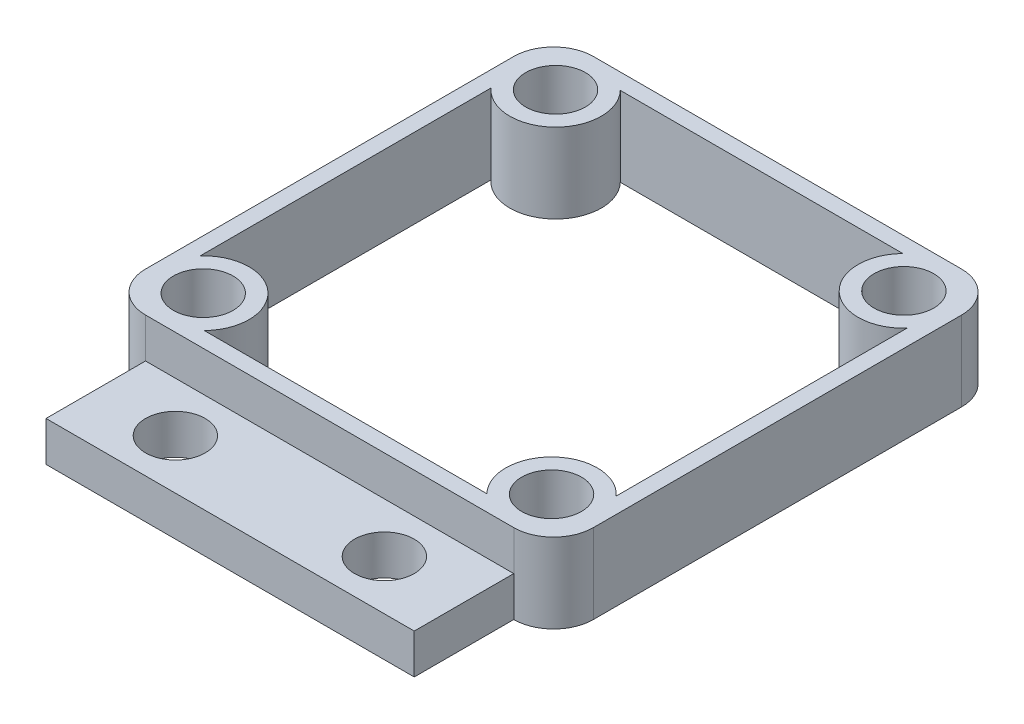
ISO-10303-21;
HEADER;
FILE_DESCRIPTION(('STEP AP214'),'2;1');
FILE_NAME('part.step','',(''),(''),'','','');
FILE_SCHEMA(('AUTOMOTIVE_DESIGN { 1 0 10303 214 1 1 1 1 }'));
ENDSEC;
DATA;
#1=APPLICATION_CONTEXT('core data for automotive mechanical design processes');
#2=APPLICATION_PROTOCOL_DEFINITION('international standard','automotive_design',2000,#1);
#3=PRODUCT_CONTEXT('',#1,'mechanical');
#4=PRODUCT('Part','Part','',(#3));
#5=PRODUCT_RELATED_PRODUCT_CATEGORY('part','',(#4));
#6=PRODUCT_DEFINITION_FORMATION('','',#4);
#7=PRODUCT_DEFINITION_CONTEXT('part definition',#1,'design');
#8=PRODUCT_DEFINITION('design','',#6,#7);
#9=PRODUCT_DEFINITION_SHAPE('','',#8);
#10=(LENGTH_UNIT() NAMED_UNIT(*) SI_UNIT(.MILLI.,.METRE.));
#11=(NAMED_UNIT(*) PLANE_ANGLE_UNIT() SI_UNIT($,.RADIAN.));
#12=(NAMED_UNIT(*) SI_UNIT($,.STERADIAN.) SOLID_ANGLE_UNIT());
#13=UNCERTAINTY_MEASURE_WITH_UNIT(LENGTH_MEASURE(1.E-05),#10,'distance_accuracy_value','');
#14=(GEOMETRIC_REPRESENTATION_CONTEXT(3) GLOBAL_UNCERTAINTY_ASSIGNED_CONTEXT((#13)) GLOBAL_UNIT_ASSIGNED_CONTEXT((#10,
#11,#12)) REPRESENTATION_CONTEXT('',''));
#15=CARTESIAN_POINT('',(0.,0.,0.));
#16=DIRECTION('',(0.,0.,1.));
#17=DIRECTION('',(1.,0.,0.));
#18=AXIS2_PLACEMENT_3D('',#15,#16,#17);
#19=CARTESIAN_POINT('',(-9.24999999999998,4.,11.25));
#20=DIRECTION('',(0.,0.,-1.));
#21=DIRECTION('',(-1.,0.,0.));
#22=AXIS2_PLACEMENT_3D('',#19,#20,#21);
#23=PLANE('',#22);
#24=DIRECTION('',(-1.,0.,0.));
#25=VECTOR('',#24,1.);
#26=CARTESIAN_POINT('',(0.,2.,11.25));
#27=LINE('',#26,#25);
#28=CARTESIAN_POINT('',(9.24999999999999,2.,11.25));
#29=VERTEX_POINT('',#28);
#30=CARTESIAN_POINT('',(-9.25,2.,11.25));
#31=VERTEX_POINT('',#30);
#32=EDGE_CURVE('E375',#29,#31,#27,.T.);
#33=ORIENTED_EDGE('',*,*,#32,.F.);
#34=DIRECTION('',(0.,-1.,0.));
#35=VECTOR('',#34,1.);
#36=CARTESIAN_POINT('',(9.24999999999999,4.,11.25));
#37=LINE('',#36,#35);
#38=CARTESIAN_POINT('',(9.24999999999999,4.,11.25));
#39=VERTEX_POINT('',#38);
#40=EDGE_CURVE('E321',#39,#29,#37,.T.);
#41=ORIENTED_EDGE('',*,*,#40,.F.);
#42=DIRECTION('',(1.,0.,0.));
#43=VECTOR('',#42,1.);
#44=CARTESIAN_POINT('',(-9.24999999999998,4.,11.25));
#45=LINE('',#44,#43);
#46=CARTESIAN_POINT('',(-9.25,4.,11.25));
#47=VERTEX_POINT('',#46);
#48=EDGE_CURVE('E295',#47,#39,#45,.T.);
#49=ORIENTED_EDGE('',*,*,#48,.F.);
#50=DIRECTION('',(0.,-1.,0.));
#51=VECTOR('',#50,1.);
#52=CARTESIAN_POINT('',(-9.25,4.,11.25));
#53=LINE('',#52,#51);
#54=EDGE_CURVE('E324',#47,#31,#53,.T.);
#55=ORIENTED_EDGE('',*,*,#54,.T.);
#56=EDGE_LOOP('',(#33,#41,#49,#55));
#57=FACE_BOUND('',#56,.T.);
#58=ADVANCED_FACE('F43',(#57),#23,.F.);
#59=CARTESIAN_POINT('',(9.25,4.,-9.25));
#60=DIRECTION('',(0.,-1.,0.));
#61=DIRECTION('',(0.,0.,-1.));
#62=AXIS2_PLACEMENT_3D('',#59,#60,#61);
#63=PLANE('',#62);
#64=CARTESIAN_POINT('',(-8.74999999999999,4.,8.85000000000002));
#65=DIRECTION('',(0.,1.,0.));
#66=DIRECTION('',(0.,0.,1.));
#67=AXIS2_PLACEMENT_3D('',#64,#65,#66);
#68=CIRCLE('',#67,1.5);
#69=CARTESIAN_POINT('',(-8.74999999999999,4.,10.35));
#70=VERTEX_POINT('',#69);
#71=EDGE_CURVE('E259',#70,#70,#68,.T.);
#72=ORIENTED_EDGE('',*,*,#71,.F.);
#73=EDGE_LOOP('',(#72));
#74=FACE_BOUND('',#73,.T.);
#75=CARTESIAN_POINT('',(-8.74999999999999,4.,-8.84999999999998));
#76=DIRECTION('',(0.,1.,0.));
#77=DIRECTION('',(0.,0.,-1.));
#78=AXIS2_PLACEMENT_3D('',#75,#76,#77);
#79=CIRCLE('',#78,1.5);
#80=CARTESIAN_POINT('',(-8.74999999999999,4.,-10.35));
#81=VERTEX_POINT('',#80);
#82=EDGE_CURVE('E265',#81,#81,#79,.T.);
#83=ORIENTED_EDGE('',*,*,#82,.F.);
#84=EDGE_LOOP('',(#83));
#85=FACE_BOUND('',#84,.T.);
#86=CARTESIAN_POINT('',(8.75000000000004,4.,8.85000000000001));
#87=DIRECTION('',(0.,1.,0.));
#88=DIRECTION('',(0.,0.,-1.));
#89=AXIS2_PLACEMENT_3D('',#86,#87,#88);
#90=CIRCLE('',#89,1.5);
#91=CARTESIAN_POINT('',(8.75000000000004,4.,7.35000000000001));
#92=VERTEX_POINT('',#91);
#93=EDGE_CURVE('E271',#92,#92,#90,.T.);
#94=ORIENTED_EDGE('',*,*,#93,.F.);
#95=EDGE_LOOP('',(#94));
#96=FACE_BOUND('',#95,.T.);
#97=CARTESIAN_POINT('',(8.75,4.,-8.85));
#98=DIRECTION('',(0.,1.,0.));
#99=DIRECTION('',(0.,0.,1.));
#100=AXIS2_PLACEMENT_3D('',#97,#98,#99);
#101=CIRCLE('',#100,1.5);
#102=CARTESIAN_POINT('',(8.75,4.,-7.35));
#103=VERTEX_POINT('',#102);
#104=EDGE_CURVE('E277',#103,#103,#101,.T.);
#105=ORIENTED_EDGE('',*,*,#104,.F.);
#106=EDGE_LOOP('',(#105));
#107=FACE_BOUND('',#106,.T.);
#108=CARTESIAN_POINT('',(9.25,4.,-9.25));
#109=DIRECTION('',(0.,1.,0.));
#110=DIRECTION('',(0.,0.,-1.));
#111=AXIS2_PLACEMENT_3D('',#108,#109,#110);
#112=CIRCLE('',#111,2.);
#113=CARTESIAN_POINT('',(11.25,4.,-9.24999999999998));
#114=VERTEX_POINT('',#113);
#115=CARTESIAN_POINT('',(9.24999999999998,4.,-11.25));
#116=VERTEX_POINT('',#115);
#117=EDGE_CURVE('E283',#114,#116,#112,.T.);
#118=ORIENTED_EDGE('',*,*,#117,.T.);
#119=DIRECTION('',(-1.,0.,0.));
#120=VECTOR('',#119,1.);
#121=CARTESIAN_POINT('',(-9.24999999999999,4.,-11.25));
#122=LINE('',#121,#120);
#123=CARTESIAN_POINT('',(-9.24999999999999,4.,-11.25));
#124=VERTEX_POINT('',#123);
#125=EDGE_CURVE('E286',#116,#124,#122,.T.);
#126=ORIENTED_EDGE('',*,*,#125,.T.);
#127=CARTESIAN_POINT('',(-9.25,4.,-9.25));
#128=DIRECTION('',(0.,1.,0.));
#129=DIRECTION('',(0.,0.,1.));
#130=AXIS2_PLACEMENT_3D('',#127,#128,#129);
#131=CIRCLE('',#130,2.);
#132=CARTESIAN_POINT('',(-11.25,4.,-9.24999999999998));
#133=VERTEX_POINT('',#132);
#134=EDGE_CURVE('E289',#124,#133,#131,.T.);
#135=ORIENTED_EDGE('',*,*,#134,.T.);
#136=DIRECTION('',(0.,0.,1.));
#137=VECTOR('',#136,1.);
#138=CARTESIAN_POINT('',(-11.25,4.,-9.24999999999998));
#139=LINE('',#138,#137);
#140=CARTESIAN_POINT('',(-11.25,4.,9.24999999999999));
#141=VERTEX_POINT('',#140);
#142=EDGE_CURVE('E291',#133,#141,#139,.T.);
#143=ORIENTED_EDGE('',*,*,#142,.T.);
#144=CARTESIAN_POINT('',(-9.25,4.,9.25));
#145=DIRECTION('',(0.,1.,0.));
#146=DIRECTION('',(0.,0.,1.));
#147=AXIS2_PLACEMENT_3D('',#144,#145,#146);
#148=CIRCLE('',#147,2.);
#149=EDGE_CURVE('E293',#141,#47,#148,.T.);
#150=ORIENTED_EDGE('',*,*,#149,.T.);
#151=ORIENTED_EDGE('',*,*,#48,.T.);
#152=CARTESIAN_POINT('',(9.25,4.,9.25));
#153=DIRECTION('',(0.,1.,0.));
#154=DIRECTION('',(0.,0.,1.));
#155=AXIS2_PLACEMENT_3D('',#152,#153,#154);
#156=CIRCLE('',#155,2.);
#157=CARTESIAN_POINT('',(11.25,4.,9.24999999999999));
#158=VERTEX_POINT('',#157);
#159=EDGE_CURVE('E297',#39,#158,#156,.T.);
#160=ORIENTED_EDGE('',*,*,#159,.T.);
#161=DIRECTION('',(0.,0.,-1.));
#162=VECTOR('',#161,1.);
#163=CARTESIAN_POINT('',(11.25,4.,-9.24999999999998));
#164=LINE('',#163,#162);
#165=EDGE_CURVE('E299',#158,#114,#164,.T.);
#166=ORIENTED_EDGE('',*,*,#165,.T.);
#167=EDGE_LOOP('',(#118,#126,#135,#143,#150,#151,#160,#166));
#168=FACE_BOUND('',#167,.T.);
#169=CARTESIAN_POINT('',(8.75,4.,-8.85));
#170=DIRECTION('',(0.,-1.,0.));
#171=DIRECTION('',(0.,0.,1.));
#172=AXIS2_PLACEMENT_3D('',#169,#170,#171);
#173=CIRCLE('',#172,2.3);
#174=CARTESIAN_POINT('',(10.45,4.,-7.30080666151704));
#175=VERTEX_POINT('',#174);
#176=CARTESIAN_POINT('',(7.09772883581416,4.,-10.45));
#177=VERTEX_POINT('',#176);
#178=EDGE_CURVE('E207',#175,#177,#173,.T.);
#179=ORIENTED_EDGE('',*,*,#178,.F.);
#180=DIRECTION('',(0.,0.,-1.));
#181=VECTOR('',#180,1.);
#182=CARTESIAN_POINT('',(10.45,4.,-7.30080666151704));
#183=LINE('',#182,#181);
#184=CARTESIAN_POINT('',(10.45,4.,7.300806661517));
#185=VERTEX_POINT('',#184);
#186=EDGE_CURVE('E222',#185,#175,#183,.T.);
#187=ORIENTED_EDGE('',*,*,#186,.F.);
#188=CARTESIAN_POINT('',(8.75000000000004,4.,8.85000000000001));
#189=DIRECTION('',(0.,-1.,0.));
#190=DIRECTION('',(0.,0.,-1.));
#191=AXIS2_PLACEMENT_3D('',#188,#189,#190);
#192=CIRCLE('',#191,2.3);
#193=CARTESIAN_POINT('',(7.0977288358142,4.,10.45));
#194=VERTEX_POINT('',#193);
#195=EDGE_CURVE('E220',#194,#185,#192,.T.);
#196=ORIENTED_EDGE('',*,*,#195,.F.);
#197=DIRECTION('',(1.,0.,0.));
#198=VECTOR('',#197,1.);
#199=CARTESIAN_POINT('',(-7.09772883581414,4.,10.45));
#200=LINE('',#199,#198);
#201=CARTESIAN_POINT('',(-7.09772883581414,4.,10.45));
#202=VERTEX_POINT('',#201);
#203=EDGE_CURVE('E218',#202,#194,#200,.T.);
#204=ORIENTED_EDGE('',*,*,#203,.F.);
#205=CARTESIAN_POINT('',(-8.74999999999999,4.,8.85000000000002));
#206=DIRECTION('',(0.,-1.,0.));
#207=DIRECTION('',(0.,0.,1.));
#208=AXIS2_PLACEMENT_3D('',#205,#206,#207);
#209=CIRCLE('',#208,2.3);
#210=CARTESIAN_POINT('',(-10.45,4.,7.30080666151706));
#211=VERTEX_POINT('',#210);
#212=EDGE_CURVE('E216',#211,#202,#209,.T.);
#213=ORIENTED_EDGE('',*,*,#212,.F.);
#214=DIRECTION('',(0.,0.,1.));
#215=VECTOR('',#214,1.);
#216=CARTESIAN_POINT('',(-10.45,4.,-7.30080666151702));
#217=LINE('',#216,#215);
#218=CARTESIAN_POINT('',(-10.45,4.,-7.30080666151702));
#219=VERTEX_POINT('',#218);
#220=EDGE_CURVE('E214',#219,#211,#217,.T.);
#221=ORIENTED_EDGE('',*,*,#220,.F.);
#222=CARTESIAN_POINT('',(-8.74999999999999,4.,-8.84999999999998));
#223=DIRECTION('',(0.,-1.,0.));
#224=DIRECTION('',(0.,0.,-1.));
#225=AXIS2_PLACEMENT_3D('',#222,#223,#224);
#226=CIRCLE('',#225,2.3);
#227=CARTESIAN_POINT('',(-7.09772883581418,4.,-10.45));
#228=VERTEX_POINT('',#227);
#229=EDGE_CURVE('E212',#228,#219,#226,.T.);
#230=ORIENTED_EDGE('',*,*,#229,.F.);
#231=DIRECTION('',(-1.,0.,0.));
#232=VECTOR('',#231,1.);
#233=CARTESIAN_POINT('',(-7.09772883581418,4.,-10.45));
#234=LINE('',#233,#232);
#235=EDGE_CURVE('E209',#177,#228,#234,.T.);
#236=ORIENTED_EDGE('',*,*,#235,.F.);
#237=EDGE_LOOP('',(#179,#187,#196,#204,#213,#221,#230,#236));
#238=FACE_BOUND('',#237,.T.);
#239=ADVANCED_FACE('F358',(#74,#85,#96,#107,#168,#238),#63,.F.);
#240=CARTESIAN_POINT('',(9.25,0.,-9.25));
#241=DIRECTION('',(0.,-1.,0.));
#242=DIRECTION('',(0.,0.,-1.));
#243=AXIS2_PLACEMENT_3D('',#240,#241,#242);
#244=PLANE('',#243);
#245=CARTESIAN_POINT('',(5.24999999999999,0.,13.75));
#246=DIRECTION('',(0.,-1.,0.));
#247=DIRECTION('',(0.,0.,-1.));
#248=AXIS2_PLACEMENT_3D('',#245,#246,#247);
#249=CIRCLE('',#248,1.5);
#250=CARTESIAN_POINT('',(5.24999999999999,0.,12.25));
#251=VERTEX_POINT('',#250);
#252=EDGE_CURVE('E376',#251,#251,#249,.T.);
#253=ORIENTED_EDGE('',*,*,#252,.F.);
#254=EDGE_LOOP('',(#253));
#255=FACE_BOUND('',#254,.T.);
#256=CARTESIAN_POINT('',(-5.24999999999999,0.,13.75));
#257=DIRECTION('',(0.,-1.,0.));
#258=DIRECTION('',(0.,0.,-1.));
#259=AXIS2_PLACEMENT_3D('',#256,#257,#258);
#260=CIRCLE('',#259,1.5);
#261=CARTESIAN_POINT('',(-5.24999999999999,0.,12.25));
#262=VERTEX_POINT('',#261);
#263=EDGE_CURVE('E380',#262,#262,#260,.T.);
#264=ORIENTED_EDGE('',*,*,#263,.F.);
#265=EDGE_LOOP('',(#264));
#266=FACE_BOUND('',#265,.T.);
#267=CARTESIAN_POINT('',(-8.74999999999999,0.,-8.84999999999998));
#268=DIRECTION('',(0.,1.,0.));
#269=DIRECTION('',(0.,0.,-1.));
#270=AXIS2_PLACEMENT_3D('',#267,#268,#269);
#271=CIRCLE('',#270,1.5);
#272=CARTESIAN_POINT('',(-8.74999999999999,0.,-10.35));
#273=VERTEX_POINT('',#272);
#274=EDGE_CURVE('E262',#273,#273,#271,.T.);
#275=ORIENTED_EDGE('',*,*,#274,.T.);
#276=EDGE_LOOP('',(#275));
#277=FACE_BOUND('',#276,.T.);
#278=CARTESIAN_POINT('',(8.75,0.,-8.85));
#279=DIRECTION('',(0.,1.,0.));
#280=DIRECTION('',(0.,0.,1.));
#281=AXIS2_PLACEMENT_3D('',#278,#279,#280);
#282=CIRCLE('',#281,1.5);
#283=CARTESIAN_POINT('',(8.75,0.,-7.35));
#284=VERTEX_POINT('',#283);
#285=EDGE_CURVE('E274',#284,#284,#282,.T.);
#286=ORIENTED_EDGE('',*,*,#285,.T.);
#287=EDGE_LOOP('',(#286));
#288=FACE_BOUND('',#287,.T.);
#289=CARTESIAN_POINT('',(9.25,0.,-9.25));
#290=DIRECTION('',(0.,1.,0.));
#291=DIRECTION('',(0.,0.,-1.));
#292=AXIS2_PLACEMENT_3D('',#289,#290,#291);
#293=CIRCLE('',#292,2.);
#294=CARTESIAN_POINT('',(11.25,0.,-9.24999999999998));
#295=VERTEX_POINT('',#294);
#296=CARTESIAN_POINT('',(9.24999999999998,0.,-11.25));
#297=VERTEX_POINT('',#296);
#298=EDGE_CURVE('E280',#295,#297,#293,.T.);
#299=ORIENTED_EDGE('',*,*,#298,.F.);
#300=DIRECTION('',(0.,0.,-1.));
#301=VECTOR('',#300,1.);
#302=CARTESIAN_POINT('',(11.25,0.,-9.24999999999998));
#303=LINE('',#302,#301);
#304=CARTESIAN_POINT('',(11.25,0.,9.24999999999999));
#305=VERTEX_POINT('',#304);
#306=EDGE_CURVE('E287',#305,#295,#303,.T.);
#307=ORIENTED_EDGE('',*,*,#306,.F.);
#308=CARTESIAN_POINT('',(9.25,0.,9.25));
#309=DIRECTION('',(0.,1.,0.));
#310=DIRECTION('',(0.,0.,1.));
#311=AXIS2_PLACEMENT_3D('',#308,#309,#310);
#312=CIRCLE('',#311,2.);
#313=CARTESIAN_POINT('',(9.24999999999999,0.,11.25));
#314=VERTEX_POINT('',#313);
#315=EDGE_CURVE('E313',#314,#305,#312,.T.);
#316=ORIENTED_EDGE('',*,*,#315,.F.);
#317=DIRECTION('',(0.,0.,-1.));
#318=VECTOR('',#317,1.);
#319=CARTESIAN_POINT('',(9.24999999999999,0.,16.25));
#320=LINE('',#319,#318);
#321=CARTESIAN_POINT('',(9.24999999999999,0.,16.25));
#322=VERTEX_POINT('',#321);
#323=EDGE_CURVE('E386',#322,#314,#320,.T.);
#324=ORIENTED_EDGE('',*,*,#323,.F.);
#325=DIRECTION('',(1.,0.,0.));
#326=VECTOR('',#325,1.);
#327=CARTESIAN_POINT('',(0.,0.,16.25));
#328=LINE('',#327,#326);
#329=CARTESIAN_POINT('',(-9.25,0.,16.25));
#330=VERTEX_POINT('',#329);
#331=EDGE_CURVE('E191',#330,#322,#328,.T.);
#332=ORIENTED_EDGE('',*,*,#331,.F.);
#333=DIRECTION('',(0.,0.,-1.));
#334=VECTOR('',#333,1.);
#335=CARTESIAN_POINT('',(-9.25,0.,16.25));
#336=LINE('',#335,#334);
#337=CARTESIAN_POINT('',(-9.25,0.,11.25));
#338=VERTEX_POINT('',#337);
#339=EDGE_CURVE('E203',#330,#338,#336,.T.);
#340=ORIENTED_EDGE('',*,*,#339,.T.);
#341=CARTESIAN_POINT('',(-9.25,0.,9.25));
#342=DIRECTION('',(0.,1.,0.));
#343=DIRECTION('',(0.,0.,1.));
#344=AXIS2_PLACEMENT_3D('',#341,#342,#343);
#345=CIRCLE('',#344,2.);
#346=CARTESIAN_POINT('',(-11.25,0.,9.24999999999999));
#347=VERTEX_POINT('',#346);
#348=EDGE_CURVE('E310',#347,#338,#345,.T.);
#349=ORIENTED_EDGE('',*,*,#348,.F.);
#350=DIRECTION('',(0.,0.,1.));
#351=VECTOR('',#350,1.);
#352=CARTESIAN_POINT('',(-11.25,0.,-9.24999999999998));
#353=LINE('',#352,#351);
#354=CARTESIAN_POINT('',(-11.25,0.,-9.24999999999998));
#355=VERTEX_POINT('',#354);
#356=EDGE_CURVE('E308',#355,#347,#353,.T.);
#357=ORIENTED_EDGE('',*,*,#356,.F.);
#358=CARTESIAN_POINT('',(-9.25,0.,-9.25));
#359=DIRECTION('',(0.,1.,0.));
#360=DIRECTION('',(0.,0.,1.));
#361=AXIS2_PLACEMENT_3D('',#358,#359,#360);
#362=CIRCLE('',#361,2.);
#363=CARTESIAN_POINT('',(-9.24999999999999,0.,-11.25));
#364=VERTEX_POINT('',#363);
#365=EDGE_CURVE('E306',#364,#355,#362,.T.);
#366=ORIENTED_EDGE('',*,*,#365,.F.);
#367=DIRECTION('',(-1.,0.,0.));
#368=VECTOR('',#367,1.);
#369=CARTESIAN_POINT('',(-9.24999999999999,0.,-11.25));
#370=LINE('',#369,#368);
#371=EDGE_CURVE('E304',#297,#364,#370,.T.);
#372=ORIENTED_EDGE('',*,*,#371,.F.);
#373=EDGE_LOOP('',(#299,#307,#316,#324,#332,#340,#349,#357,#366,#372));
#374=FACE_BOUND('',#373,.T.);
#375=CARTESIAN_POINT('',(8.75000000000004,0.,8.85000000000001));
#376=DIRECTION('',(0.,1.,0.));
#377=DIRECTION('',(0.,0.,-1.));
#378=AXIS2_PLACEMENT_3D('',#375,#376,#377);
#379=CIRCLE('',#378,1.5);
#380=CARTESIAN_POINT('',(8.75000000000004,0.,7.35000000000001));
#381=VERTEX_POINT('',#380);
#382=EDGE_CURVE('E268',#381,#381,#379,.T.);
#383=ORIENTED_EDGE('',*,*,#382,.T.);
#384=EDGE_LOOP('',(#383));
#385=FACE_BOUND('',#384,.T.);
#386=CARTESIAN_POINT('',(-8.74999999999999,0.,8.85000000000002));
#387=DIRECTION('',(0.,1.,0.));
#388=DIRECTION('',(0.,0.,1.));
#389=AXIS2_PLACEMENT_3D('',#386,#387,#388);
#390=CIRCLE('',#389,1.5);
#391=CARTESIAN_POINT('',(-8.74999999999999,0.,10.35));
#392=VERTEX_POINT('',#391);
#393=EDGE_CURVE('E258',#392,#392,#390,.T.);
#394=ORIENTED_EDGE('',*,*,#393,.T.);
#395=EDGE_LOOP('',(#394));
#396=FACE_BOUND('',#395,.T.);
#397=DIRECTION('',(0.,0.,-1.));
#398=VECTOR('',#397,1.);
#399=CARTESIAN_POINT('',(10.45,0.,-7.30080666151704));
#400=LINE('',#399,#398);
#401=CARTESIAN_POINT('',(10.45,0.,7.300806661517));
#402=VERTEX_POINT('',#401);
#403=CARTESIAN_POINT('',(10.45,0.,-7.30080666151704));
#404=VERTEX_POINT('',#403);
#405=EDGE_CURVE('E210',#402,#404,#400,.T.);
#406=ORIENTED_EDGE('',*,*,#405,.T.);
#407=CARTESIAN_POINT('',(8.75,0.,-8.85));
#408=DIRECTION('',(0.,-1.,0.));
#409=DIRECTION('',(0.,0.,1.));
#410=AXIS2_PLACEMENT_3D('',#407,#408,#409);
#411=CIRCLE('',#410,2.3);
#412=CARTESIAN_POINT('',(7.09772883581416,0.,-10.45));
#413=VERTEX_POINT('',#412);
#414=EDGE_CURVE('E66',#404,#413,#411,.T.);
#415=ORIENTED_EDGE('',*,*,#414,.T.);
#416=DIRECTION('',(-1.,0.,0.));
#417=VECTOR('',#416,1.);
#418=CARTESIAN_POINT('',(-7.09772883581418,0.,-10.45));
#419=LINE('',#418,#417);
#420=CARTESIAN_POINT('',(-7.09772883581418,0.,-10.45));
#421=VERTEX_POINT('',#420);
#422=EDGE_CURVE('E201',#413,#421,#419,.T.);
#423=ORIENTED_EDGE('',*,*,#422,.T.);
#424=CARTESIAN_POINT('',(-8.74999999999999,0.,-8.84999999999998));
#425=DIRECTION('',(0.,-1.,0.));
#426=DIRECTION('',(0.,0.,-1.));
#427=AXIS2_PLACEMENT_3D('',#424,#425,#426);
#428=CIRCLE('',#427,2.3);
#429=CARTESIAN_POINT('',(-10.45,0.,-7.30080666151702));
#430=VERTEX_POINT('',#429);
#431=EDGE_CURVE('E227',#421,#430,#428,.T.);
#432=ORIENTED_EDGE('',*,*,#431,.T.);
#433=DIRECTION('',(0.,0.,1.));
#434=VECTOR('',#433,1.);
#435=CARTESIAN_POINT('',(-10.45,0.,-7.30080666151702));
#436=LINE('',#435,#434);
#437=CARTESIAN_POINT('',(-10.45,0.,7.30080666151706));
#438=VERTEX_POINT('',#437);
#439=EDGE_CURVE('E230',#430,#438,#436,.T.);
#440=ORIENTED_EDGE('',*,*,#439,.T.);
#441=CARTESIAN_POINT('',(-8.74999999999999,0.,8.85000000000002));
#442=DIRECTION('',(0.,-1.,0.));
#443=DIRECTION('',(0.,0.,1.));
#444=AXIS2_PLACEMENT_3D('',#441,#442,#443);
#445=CIRCLE('',#444,2.3);
#446=CARTESIAN_POINT('',(-7.09772883581414,0.,10.45));
#447=VERTEX_POINT('',#446);
#448=EDGE_CURVE('E233',#438,#447,#445,.T.);
#449=ORIENTED_EDGE('',*,*,#448,.T.);
#450=DIRECTION('',(1.,0.,0.));
#451=VECTOR('',#450,1.);
#452=CARTESIAN_POINT('',(-7.09772883581414,0.,10.45));
#453=LINE('',#452,#451);
#454=CARTESIAN_POINT('',(7.0977288358142,0.,10.45));
#455=VERTEX_POINT('',#454);
#456=EDGE_CURVE('E236',#447,#455,#453,.T.);
#457=ORIENTED_EDGE('',*,*,#456,.T.);
#458=CARTESIAN_POINT('',(8.75000000000004,0.,8.85000000000001));
#459=DIRECTION('',(0.,-1.,0.));
#460=DIRECTION('',(0.,0.,-1.));
#461=AXIS2_PLACEMENT_3D('',#458,#459,#460);
#462=CIRCLE('',#461,2.3);
#463=EDGE_CURVE('E239',#455,#402,#462,.T.);
#464=ORIENTED_EDGE('',*,*,#463,.T.);
#465=EDGE_LOOP('',(#406,#415,#423,#432,#440,#449,#457,#464));
#466=FACE_BOUND('',#465,.T.);
#467=ADVANCED_FACE('F343',(#255,#266,#277,#288,#374,#385,#396,#466),#244,.T.);
#468=CARTESIAN_POINT('',(9.25,4.,-9.25));
#469=DIRECTION('',(0.,-1.,0.));
#470=DIRECTION('',(0.,0.,-1.));
#471=AXIS2_PLACEMENT_3D('',#468,#469,#470);
#472=CYLINDRICAL_SURFACE('',#471,2.);
#473=ORIENTED_EDGE('',*,*,#298,.T.);
#474=DIRECTION('',(0.,-1.,0.));
#475=VECTOR('',#474,1.);
#476=CARTESIAN_POINT('',(9.24999999999998,4.,-11.25));
#477=LINE('',#476,#475);
#478=EDGE_CURVE('E11',#116,#297,#477,.T.);
#479=ORIENTED_EDGE('',*,*,#478,.F.);
#480=ORIENTED_EDGE('',*,*,#117,.F.);
#481=DIRECTION('',(0.,-1.,0.));
#482=VECTOR('',#481,1.);
#483=CARTESIAN_POINT('',(11.25,4.,-9.24999999999998));
#484=LINE('',#483,#482);
#485=EDGE_CURVE('E301',#114,#295,#484,.T.);
#486=ORIENTED_EDGE('',*,*,#485,.T.);
#487=EDGE_LOOP('',(#473,#479,#480,#486));
#488=FACE_BOUND('',#487,.T.);
#489=ADVANCED_FACE('F45',(#488),#472,.T.);
#490=CARTESIAN_POINT('',(-9.24999999999999,4.,-11.25));
#491=DIRECTION('',(0.,0.,1.));
#492=DIRECTION('',(1.,0.,0.));
#493=AXIS2_PLACEMENT_3D('',#490,#491,#492);
#494=PLANE('',#493);
#495=ORIENTED_EDGE('',*,*,#371,.T.);
#496=DIRECTION('',(0.,-1.,0.));
#497=VECTOR('',#496,1.);
#498=CARTESIAN_POINT('',(-9.24999999999999,4.,-11.25));
#499=LINE('',#498,#497);
#500=EDGE_CURVE('E51',#124,#364,#499,.T.);
#501=ORIENTED_EDGE('',*,*,#500,.F.);
#502=ORIENTED_EDGE('',*,*,#125,.F.);
#503=ORIENTED_EDGE('',*,*,#478,.T.);
#504=EDGE_LOOP('',(#495,#501,#502,#503));
#505=FACE_BOUND('',#504,.T.);
#506=ADVANCED_FACE('F363',(#505),#494,.F.);
#507=CARTESIAN_POINT('',(-9.25,4.,-9.25));
#508=DIRECTION('',(0.,-1.,0.));
#509=DIRECTION('',(0.,0.,-1.));
#510=AXIS2_PLACEMENT_3D('',#507,#508,#509);
#511=CYLINDRICAL_SURFACE('',#510,2.);
#512=ORIENTED_EDGE('',*,*,#365,.T.);
#513=DIRECTION('',(0.,-1.,0.));
#514=VECTOR('',#513,1.);
#515=CARTESIAN_POINT('',(-11.25,4.,-9.24999999999998));
#516=LINE('',#515,#514);
#517=EDGE_CURVE('E330',#133,#355,#516,.T.);
#518=ORIENTED_EDGE('',*,*,#517,.F.);
#519=ORIENTED_EDGE('',*,*,#134,.F.);
#520=ORIENTED_EDGE('',*,*,#500,.T.);
#521=EDGE_LOOP('',(#512,#518,#519,#520));
#522=FACE_BOUND('',#521,.T.);
#523=ADVANCED_FACE('F337',(#522),#511,.T.);
#524=CARTESIAN_POINT('',(-11.25,4.,-9.24999999999998));
#525=DIRECTION('',(1.,0.,0.));
#526=DIRECTION('',(0.,0.,-1.));
#527=AXIS2_PLACEMENT_3D('',#524,#525,#526);
#528=PLANE('',#527);
#529=ORIENTED_EDGE('',*,*,#356,.T.);
#530=DIRECTION('',(0.,-1.,0.));
#531=VECTOR('',#530,1.);
#532=CARTESIAN_POINT('',(-11.25,4.,9.24999999999999));
#533=LINE('',#532,#531);
#534=EDGE_CURVE('E327',#141,#347,#533,.T.);
#535=ORIENTED_EDGE('',*,*,#534,.F.);
#536=ORIENTED_EDGE('',*,*,#142,.F.);
#537=ORIENTED_EDGE('',*,*,#517,.T.);
#538=EDGE_LOOP('',(#529,#535,#536,#537));
#539=FACE_BOUND('',#538,.T.);
#540=ADVANCED_FACE('F349',(#539),#528,.F.);
#541=CARTESIAN_POINT('',(-9.25,4.,9.25));
#542=DIRECTION('',(0.,-1.,0.));
#543=DIRECTION('',(0.,0.,-1.));
#544=AXIS2_PLACEMENT_3D('',#541,#542,#543);
#545=CYLINDRICAL_SURFACE('',#544,2.);
#546=ORIENTED_EDGE('',*,*,#348,.T.);
#547=DIRECTION('',(0.,-1.,0.));
#548=VECTOR('',#547,1.);
#549=CARTESIAN_POINT('',(-9.25,0.,11.25));
#550=LINE('',#549,#548);
#551=EDGE_CURVE('E194',#31,#338,#550,.T.);
#552=ORIENTED_EDGE('',*,*,#551,.F.);
#553=ORIENTED_EDGE('',*,*,#54,.F.);
#554=ORIENTED_EDGE('',*,*,#149,.F.);
#555=ORIENTED_EDGE('',*,*,#534,.T.);
#556=EDGE_LOOP('',(#546,#552,#553,#554,#555));
#557=FACE_BOUND('',#556,.T.);
#558=ADVANCED_FACE('F353',(#557),#545,.T.);
#559=CARTESIAN_POINT('',(9.25,4.,9.25));
#560=DIRECTION('',(0.,-1.,0.));
#561=DIRECTION('',(0.,0.,-1.));
#562=AXIS2_PLACEMENT_3D('',#559,#560,#561);
#563=CYLINDRICAL_SURFACE('',#562,2.);
#564=ORIENTED_EDGE('',*,*,#315,.T.);
#565=DIRECTION('',(0.,-1.,0.));
#566=VECTOR('',#565,1.);
#567=CARTESIAN_POINT('',(11.25,4.,9.24999999999999));
#568=LINE('',#567,#566);
#569=EDGE_CURVE('E318',#158,#305,#568,.T.);
#570=ORIENTED_EDGE('',*,*,#569,.F.);
#571=ORIENTED_EDGE('',*,*,#159,.F.);
#572=ORIENTED_EDGE('',*,*,#40,.T.);
#573=DIRECTION('',(0.,1.,0.));
#574=VECTOR('',#573,1.);
#575=CARTESIAN_POINT('',(9.24999999999999,0.,11.25));
#576=LINE('',#575,#574);
#577=EDGE_CURVE('E198',#314,#29,#576,.T.);
#578=ORIENTED_EDGE('',*,*,#577,.F.);
#579=EDGE_LOOP('',(#564,#570,#571,#572,#578));
#580=FACE_BOUND('',#579,.T.);
#581=ADVANCED_FACE('F374',(#580),#563,.T.);
#582=CARTESIAN_POINT('',(11.25,4.,-9.24999999999998));
#583=DIRECTION('',(-1.,0.,0.));
#584=DIRECTION('',(0.,0.,1.));
#585=AXIS2_PLACEMENT_3D('',#582,#583,#584);
#586=PLANE('',#585);
#587=ORIENTED_EDGE('',*,*,#306,.T.);
#588=ORIENTED_EDGE('',*,*,#485,.F.);
#589=ORIENTED_EDGE('',*,*,#165,.F.);
#590=ORIENTED_EDGE('',*,*,#569,.T.);
#591=EDGE_LOOP('',(#587,#588,#589,#590));
#592=FACE_BOUND('',#591,.T.);
#593=ADVANCED_FACE('F369',(#592),#586,.F.);
#594=CARTESIAN_POINT('',(8.75,4.,-8.85));
#595=DIRECTION('',(0.,-1.,0.));
#596=DIRECTION('',(0.,0.,-1.));
#597=AXIS2_PLACEMENT_3D('',#594,#595,#596);
#598=CYLINDRICAL_SURFACE('',#597,1.5);
#599=ORIENTED_EDGE('',*,*,#104,.T.);
#600=EDGE_LOOP('',(#599));
#601=FACE_BOUND('',#600,.T.);
#602=ORIENTED_EDGE('',*,*,#285,.F.);
#603=EDGE_LOOP('',(#602));
#604=FACE_BOUND('',#603,.T.);
#605=ADVANCED_FACE('F424',(#601,#604),#598,.F.);
#606=CARTESIAN_POINT('',(8.75000000000004,4.,8.85000000000001));
#607=DIRECTION('',(0.,-1.,0.));
#608=DIRECTION('',(0.,0.,-1.));
#609=AXIS2_PLACEMENT_3D('',#606,#607,#608);
#610=CYLINDRICAL_SURFACE('',#609,1.5);
#611=ORIENTED_EDGE('',*,*,#93,.T.);
#612=EDGE_LOOP('',(#611));
#613=FACE_BOUND('',#612,.T.);
#614=ORIENTED_EDGE('',*,*,#382,.F.);
#615=EDGE_LOOP('',(#614));
#616=FACE_BOUND('',#615,.T.);
#617=ADVANCED_FACE('F428',(#613,#616),#610,.F.);
#618=CARTESIAN_POINT('',(-8.74999999999999,4.,-8.84999999999998));
#619=DIRECTION('',(0.,-1.,0.));
#620=DIRECTION('',(0.,0.,-1.));
#621=AXIS2_PLACEMENT_3D('',#618,#619,#620);
#622=CYLINDRICAL_SURFACE('',#621,1.5);
#623=ORIENTED_EDGE('',*,*,#82,.T.);
#624=EDGE_LOOP('',(#623));
#625=FACE_BOUND('',#624,.T.);
#626=ORIENTED_EDGE('',*,*,#274,.F.);
#627=EDGE_LOOP('',(#626));
#628=FACE_BOUND('',#627,.T.);
#629=ADVANCED_FACE('F516',(#625,#628),#622,.F.);
#630=CARTESIAN_POINT('',(-8.74999999999999,4.,8.85000000000002));
#631=DIRECTION('',(0.,-1.,0.));
#632=DIRECTION('',(0.,0.,-1.));
#633=AXIS2_PLACEMENT_3D('',#630,#631,#632);
#634=CYLINDRICAL_SURFACE('',#633,1.5);
#635=ORIENTED_EDGE('',*,*,#71,.T.);
#636=EDGE_LOOP('',(#635));
#637=FACE_BOUND('',#636,.T.);
#638=ORIENTED_EDGE('',*,*,#393,.F.);
#639=EDGE_LOOP('',(#638));
#640=FACE_BOUND('',#639,.T.);
#641=ADVANCED_FACE('F513',(#637,#640),#634,.F.);
#642=CARTESIAN_POINT('',(8.75,4.,-8.85));
#643=DIRECTION('',(0.,-1.,0.));
#644=DIRECTION('',(0.,0.,-1.));
#645=AXIS2_PLACEMENT_3D('',#642,#643,#644);
#646=CYLINDRICAL_SURFACE('',#645,2.3);
#647=ORIENTED_EDGE('',*,*,#414,.F.);
#648=DIRECTION('',(0.,-1.,0.));
#649=VECTOR('',#648,1.);
#650=CARTESIAN_POINT('',(10.45,4.,-7.30080666151704));
#651=LINE('',#650,#649);
#652=EDGE_CURVE('E223',#175,#404,#651,.T.);
#653=ORIENTED_EDGE('',*,*,#652,.F.);
#654=ORIENTED_EDGE('',*,*,#178,.T.);
#655=DIRECTION('',(0.,-1.,0.));
#656=VECTOR('',#655,1.);
#657=CARTESIAN_POINT('',(7.09772883581416,4.,-10.45));
#658=LINE('',#657,#656);
#659=EDGE_CURVE('E256',#177,#413,#658,.T.);
#660=ORIENTED_EDGE('',*,*,#659,.T.);
#661=EDGE_LOOP('',(#647,#653,#654,#660));
#662=FACE_BOUND('',#661,.T.);
#663=ADVANCED_FACE('F509',(#662),#646,.T.);
#664=CARTESIAN_POINT('',(-7.09772883581418,4.,-10.45));
#665=DIRECTION('',(0.,0.,1.));
#666=DIRECTION('',(1.,0.,0.));
#667=AXIS2_PLACEMENT_3D('',#664,#665,#666);
#668=PLANE('',#667);
#669=ORIENTED_EDGE('',*,*,#422,.F.);
#670=ORIENTED_EDGE('',*,*,#659,.F.);
#671=ORIENTED_EDGE('',*,*,#235,.T.);
#672=DIRECTION('',(0.,-1.,0.));
#673=VECTOR('',#672,1.);
#674=CARTESIAN_POINT('',(-7.09772883581418,4.,-10.45));
#675=LINE('',#674,#673);
#676=EDGE_CURVE('E254',#228,#421,#675,.T.);
#677=ORIENTED_EDGE('',*,*,#676,.T.);
#678=EDGE_LOOP('',(#669,#670,#671,#677));
#679=FACE_BOUND('',#678,.T.);
#680=ADVANCED_FACE('F505',(#679),#668,.T.);
#681=CARTESIAN_POINT('',(-8.74999999999999,4.,-8.84999999999998));
#682=DIRECTION('',(0.,-1.,0.));
#683=DIRECTION('',(0.,0.,-1.));
#684=AXIS2_PLACEMENT_3D('',#681,#682,#683);
#685=CYLINDRICAL_SURFACE('',#684,2.3);
#686=ORIENTED_EDGE('',*,*,#431,.F.);
#687=ORIENTED_EDGE('',*,*,#676,.F.);
#688=ORIENTED_EDGE('',*,*,#229,.T.);
#689=DIRECTION('',(0.,-1.,0.));
#690=VECTOR('',#689,1.);
#691=CARTESIAN_POINT('',(-10.45,4.,-7.30080666151702));
#692=LINE('',#691,#690);
#693=EDGE_CURVE('E252',#219,#430,#692,.T.);
#694=ORIENTED_EDGE('',*,*,#693,.T.);
#695=EDGE_LOOP('',(#686,#687,#688,#694));
#696=FACE_BOUND('',#695,.T.);
#697=ADVANCED_FACE('F501',(#696),#685,.T.);
#698=CARTESIAN_POINT('',(-10.45,4.,-7.30080666151702));
#699=DIRECTION('',(1.,0.,0.));
#700=DIRECTION('',(0.,0.,-1.));
#701=AXIS2_PLACEMENT_3D('',#698,#699,#700);
#702=PLANE('',#701);
#703=ORIENTED_EDGE('',*,*,#439,.F.);
#704=ORIENTED_EDGE('',*,*,#693,.F.);
#705=ORIENTED_EDGE('',*,*,#220,.T.);
#706=DIRECTION('',(0.,-1.,0.));
#707=VECTOR('',#706,1.);
#708=CARTESIAN_POINT('',(-10.45,4.,7.30080666151706));
#709=LINE('',#708,#707);
#710=EDGE_CURVE('E250',#211,#438,#709,.T.);
#711=ORIENTED_EDGE('',*,*,#710,.T.);
#712=EDGE_LOOP('',(#703,#704,#705,#711));
#713=FACE_BOUND('',#712,.T.);
#714=ADVANCED_FACE('F497',(#713),#702,.T.);
#715=CARTESIAN_POINT('',(-8.74999999999999,4.,8.85000000000002));
#716=DIRECTION('',(0.,-1.,0.));
#717=DIRECTION('',(0.,0.,-1.));
#718=AXIS2_PLACEMENT_3D('',#715,#716,#717);
#719=CYLINDRICAL_SURFACE('',#718,2.3);
#720=ORIENTED_EDGE('',*,*,#448,.F.);
#721=ORIENTED_EDGE('',*,*,#710,.F.);
#722=ORIENTED_EDGE('',*,*,#212,.T.);
#723=DIRECTION('',(0.,-1.,0.));
#724=VECTOR('',#723,1.);
#725=CARTESIAN_POINT('',(-7.09772883581414,4.,10.45));
#726=LINE('',#725,#724);
#727=EDGE_CURVE('E248',#202,#447,#726,.T.);
#728=ORIENTED_EDGE('',*,*,#727,.T.);
#729=EDGE_LOOP('',(#720,#721,#722,#728));
#730=FACE_BOUND('',#729,.T.);
#731=ADVANCED_FACE('F493',(#730),#719,.T.);
#732=CARTESIAN_POINT('',(-7.09772883581414,4.,10.45));
#733=DIRECTION('',(0.,0.,-1.));
#734=DIRECTION('',(-1.,0.,0.));
#735=AXIS2_PLACEMENT_3D('',#732,#733,#734);
#736=PLANE('',#735);
#737=ORIENTED_EDGE('',*,*,#456,.F.);
#738=ORIENTED_EDGE('',*,*,#727,.F.);
#739=ORIENTED_EDGE('',*,*,#203,.T.);
#740=DIRECTION('',(0.,-1.,0.));
#741=VECTOR('',#740,1.);
#742=CARTESIAN_POINT('',(7.0977288358142,4.,10.45));
#743=LINE('',#742,#741);
#744=EDGE_CURVE('E246',#194,#455,#743,.T.);
#745=ORIENTED_EDGE('',*,*,#744,.T.);
#746=EDGE_LOOP('',(#737,#738,#739,#745));
#747=FACE_BOUND('',#746,.T.);
#748=ADVANCED_FACE('F489',(#747),#736,.T.);
#749=CARTESIAN_POINT('',(8.75000000000004,4.,8.85000000000001));
#750=DIRECTION('',(0.,-1.,0.));
#751=DIRECTION('',(0.,0.,-1.));
#752=AXIS2_PLACEMENT_3D('',#749,#750,#751);
#753=CYLINDRICAL_SURFACE('',#752,2.3);
#754=ORIENTED_EDGE('',*,*,#463,.F.);
#755=ORIENTED_EDGE('',*,*,#744,.F.);
#756=ORIENTED_EDGE('',*,*,#195,.T.);
#757=DIRECTION('',(0.,-1.,0.));
#758=VECTOR('',#757,1.);
#759=CARTESIAN_POINT('',(10.45,4.,7.300806661517));
#760=LINE('',#759,#758);
#761=EDGE_CURVE('E58',#185,#402,#760,.T.);
#762=ORIENTED_EDGE('',*,*,#761,.T.);
#763=EDGE_LOOP('',(#754,#755,#756,#762));
#764=FACE_BOUND('',#763,.T.);
#765=ADVANCED_FACE('F486',(#764),#753,.T.);
#766=CARTESIAN_POINT('',(10.45,4.,-7.30080666151704));
#767=DIRECTION('',(-1.,0.,0.));
#768=DIRECTION('',(0.,0.,1.));
#769=AXIS2_PLACEMENT_3D('',#766,#767,#768);
#770=PLANE('',#769);
#771=ORIENTED_EDGE('',*,*,#405,.F.);
#772=ORIENTED_EDGE('',*,*,#761,.F.);
#773=ORIENTED_EDGE('',*,*,#186,.T.);
#774=ORIENTED_EDGE('',*,*,#652,.T.);
#775=EDGE_LOOP('',(#771,#772,#773,#774));
#776=FACE_BOUND('',#775,.T.);
#777=ADVANCED_FACE('F442',(#776),#770,.T.);
#778=CARTESIAN_POINT('',(9.24999999999999,0.,16.25));
#779=DIRECTION('',(-1.,0.,0.));
#780=DIRECTION('',(0.,0.,1.));
#781=AXIS2_PLACEMENT_3D('',#778,#779,#780);
#782=PLANE('',#781);
#783=ORIENTED_EDGE('',*,*,#577,.T.);
#784=DIRECTION('',(0.,0.,-1.));
#785=VECTOR('',#784,1.);
#786=CARTESIAN_POINT('',(9.24999999999999,2.,16.25));
#787=LINE('',#786,#785);
#788=CARTESIAN_POINT('',(9.24999999999999,2.,16.25));
#789=VERTEX_POINT('',#788);
#790=EDGE_CURVE('E179',#789,#29,#787,.T.);
#791=ORIENTED_EDGE('',*,*,#790,.F.);
#792=DIRECTION('',(0.,1.,0.));
#793=VECTOR('',#792,1.);
#794=CARTESIAN_POINT('',(9.24999999999999,0.,16.25));
#795=LINE('',#794,#793);
#796=EDGE_CURVE('E186',#322,#789,#795,.T.);
#797=ORIENTED_EDGE('',*,*,#796,.F.);
#798=ORIENTED_EDGE('',*,*,#323,.T.);
#799=EDGE_LOOP('',(#783,#791,#797,#798));
#800=FACE_BOUND('',#799,.T.);
#801=ADVANCED_FACE('F196',(#800),#782,.F.);
#802=CARTESIAN_POINT('',(0.,2.,16.25));
#803=DIRECTION('',(0.,-1.,0.));
#804=DIRECTION('',(0.,0.,-1.));
#805=AXIS2_PLACEMENT_3D('',#802,#803,#804);
#806=PLANE('',#805);
#807=CARTESIAN_POINT('',(5.24999999999999,2.,13.75));
#808=DIRECTION('',(0.,1.,0.));
#809=DIRECTION('',(0.,0.,1.));
#810=AXIS2_PLACEMENT_3D('',#807,#808,#809);
#811=CIRCLE('',#810,1.5);
#812=CARTESIAN_POINT('',(5.24999999999999,2.,15.25));
#813=VERTEX_POINT('',#812);
#814=EDGE_CURVE('E689',#813,#813,#811,.T.);
#815=ORIENTED_EDGE('',*,*,#814,.F.);
#816=EDGE_LOOP('',(#815));
#817=FACE_BOUND('',#816,.T.);
#818=CARTESIAN_POINT('',(-5.24999999999999,2.,13.75));
#819=DIRECTION('',(0.,1.,0.));
#820=DIRECTION('',(0.,0.,-1.));
#821=AXIS2_PLACEMENT_3D('',#818,#819,#820);
#822=CIRCLE('',#821,1.5);
#823=CARTESIAN_POINT('',(-5.24999999999999,2.,12.25));
#824=VERTEX_POINT('',#823);
#825=EDGE_CURVE('E692',#824,#824,#822,.T.);
#826=ORIENTED_EDGE('',*,*,#825,.F.);
#827=EDGE_LOOP('',(#826));
#828=FACE_BOUND('',#827,.T.);
#829=ORIENTED_EDGE('',*,*,#32,.T.);
#830=DIRECTION('',(0.,0.,-1.));
#831=VECTOR('',#830,1.);
#832=CARTESIAN_POINT('',(-9.25,2.,16.25));
#833=LINE('',#832,#831);
#834=CARTESIAN_POINT('',(-9.25,2.,16.25));
#835=VERTEX_POINT('',#834);
#836=EDGE_CURVE('E182',#835,#31,#833,.T.);
#837=ORIENTED_EDGE('',*,*,#836,.F.);
#838=DIRECTION('',(-1.,0.,0.));
#839=VECTOR('',#838,1.);
#840=CARTESIAN_POINT('',(0.,2.,16.25));
#841=LINE('',#840,#839);
#842=EDGE_CURVE('E175',#789,#835,#841,.T.);
#843=ORIENTED_EDGE('',*,*,#842,.F.);
#844=ORIENTED_EDGE('',*,*,#790,.T.);
#845=EDGE_LOOP('',(#829,#837,#843,#844));
#846=FACE_BOUND('',#845,.T.);
#847=ADVANCED_FACE('F177',(#817,#828,#846),#806,.F.);
#848=CARTESIAN_POINT('',(-9.25,0.,16.25));
#849=DIRECTION('',(1.,0.,0.));
#850=DIRECTION('',(0.,0.,-1.));
#851=AXIS2_PLACEMENT_3D('',#848,#849,#850);
#852=PLANE('',#851);
#853=ORIENTED_EDGE('',*,*,#551,.T.);
#854=ORIENTED_EDGE('',*,*,#339,.F.);
#855=DIRECTION('',(0.,-1.,0.));
#856=VECTOR('',#855,1.);
#857=CARTESIAN_POINT('',(-9.25,0.,16.25));
#858=LINE('',#857,#856);
#859=EDGE_CURVE('E185',#835,#330,#858,.T.);
#860=ORIENTED_EDGE('',*,*,#859,.F.);
#861=ORIENTED_EDGE('',*,*,#836,.T.);
#862=EDGE_LOOP('',(#853,#854,#860,#861));
#863=FACE_BOUND('',#862,.T.);
#864=ADVANCED_FACE('F389',(#863),#852,.F.);
#865=CARTESIAN_POINT('',(0.,0.,16.25));
#866=DIRECTION('',(0.,0.,1.));
#867=DIRECTION('',(1.,0.,0.));
#868=AXIS2_PLACEMENT_3D('',#865,#866,#867);
#869=PLANE('',#868);
#870=ORIENTED_EDGE('',*,*,#796,.T.);
#871=ORIENTED_EDGE('',*,*,#842,.T.);
#872=ORIENTED_EDGE('',*,*,#859,.T.);
#873=ORIENTED_EDGE('',*,*,#331,.T.);
#874=EDGE_LOOP('',(#870,#871,#872,#873));
#875=FACE_BOUND('',#874,.T.);
#876=ADVANCED_FACE('F189',(#875),#869,.T.);
#877=CARTESIAN_POINT('',(-5.24999999999999,-3.,13.75));
#878=DIRECTION('',(0.,1.,0.));
#879=DIRECTION('',(0.,0.,1.));
#880=AXIS2_PLACEMENT_3D('',#877,#878,#879);
#881=CYLINDRICAL_SURFACE('',#880,1.5);
#882=ORIENTED_EDGE('',*,*,#263,.T.);
#883=EDGE_LOOP('',(#882));
#884=FACE_BOUND('',#883,.T.);
#885=ORIENTED_EDGE('',*,*,#825,.T.);
#886=EDGE_LOOP('',(#885));
#887=FACE_BOUND('',#886,.T.);
#888=ADVANCED_FACE('F456',(#884,#887),#881,.F.);
#889=CARTESIAN_POINT('',(5.24999999999999,-3.,13.75));
#890=DIRECTION('',(0.,1.,0.));
#891=DIRECTION('',(0.,0.,1.));
#892=AXIS2_PLACEMENT_3D('',#889,#890,#891);
#893=CYLINDRICAL_SURFACE('',#892,1.5);
#894=ORIENTED_EDGE('',*,*,#252,.T.);
#895=EDGE_LOOP('',(#894));
#896=FACE_BOUND('',#895,.T.);
#897=ORIENTED_EDGE('',*,*,#814,.T.);
#898=EDGE_LOOP('',(#897));
#899=FACE_BOUND('',#898,.T.);
#900=ADVANCED_FACE('F468',(#896,#899),#893,.F.);
#901=CLOSED_SHELL('',(#58,#239,#467,#489,#506,#523,#540,#558,#581,#593,#605,#617,#629,#641,#663,
#680,#697,#714,#731,#748,#765,#777,#801,#847,#864,#876,#888,#900));
#902=MANIFOLD_SOLID_BREP('B2',#901);
#903=ADVANCED_BREP_SHAPE_REPRESENTATION('',(#18,#902),#14);
#904=SHAPE_DEFINITION_REPRESENTATION(#9,#903);
ENDSEC;
END-ISO-10303-21;
